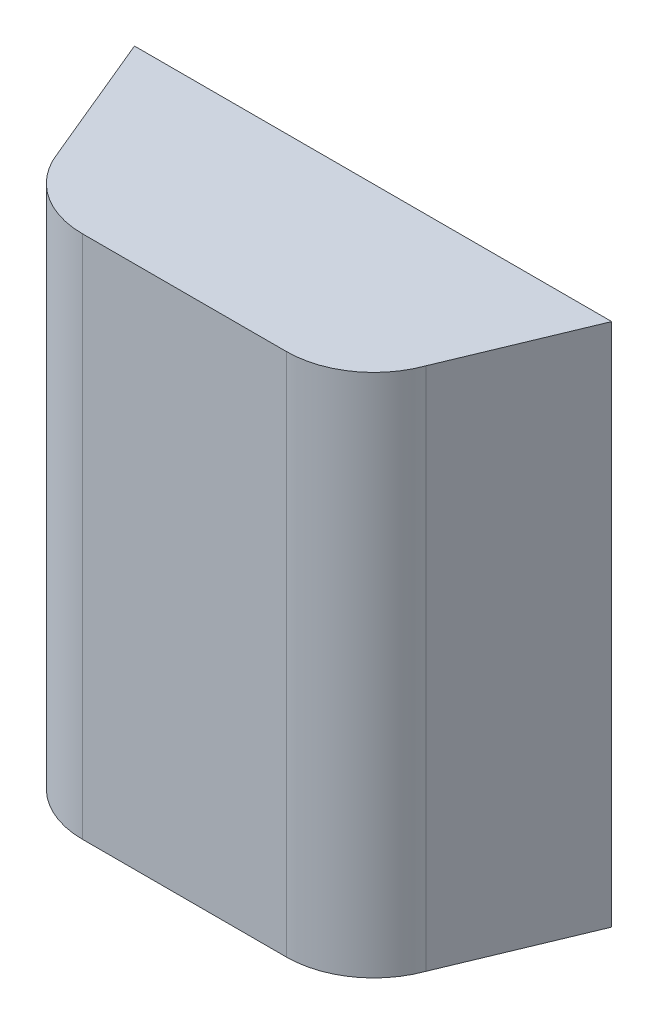
ISO-10303-21;
HEADER;
FILE_DESCRIPTION(('STEP AP214'),'2;1');
FILE_NAME('part.step','',(''),(''),'','','');
FILE_SCHEMA(('AUTOMOTIVE_DESIGN { 1 0 10303 214 1 1 1 1 }'));
ENDSEC;
DATA;
#1=APPLICATION_CONTEXT('core data for automotive mechanical design processes');
#2=APPLICATION_PROTOCOL_DEFINITION('international standard','automotive_design',2000,#1);
#3=PRODUCT_CONTEXT('',#1,'mechanical');
#4=PRODUCT('Part','Part','',(#3));
#5=PRODUCT_RELATED_PRODUCT_CATEGORY('part','',(#4));
#6=PRODUCT_DEFINITION_FORMATION('','',#4);
#7=PRODUCT_DEFINITION_CONTEXT('part definition',#1,'design');
#8=PRODUCT_DEFINITION('design','',#6,#7);
#9=PRODUCT_DEFINITION_SHAPE('','',#8);
#10=(LENGTH_UNIT() NAMED_UNIT(*) SI_UNIT(.MILLI.,.METRE.));
#11=(NAMED_UNIT(*) PLANE_ANGLE_UNIT() SI_UNIT($,.RADIAN.));
#12=(NAMED_UNIT(*) SI_UNIT($,.STERADIAN.) SOLID_ANGLE_UNIT());
#13=UNCERTAINTY_MEASURE_WITH_UNIT(LENGTH_MEASURE(1.E-05),#10,'distance_accuracy_value','');
#14=(GEOMETRIC_REPRESENTATION_CONTEXT(3) GLOBAL_UNCERTAINTY_ASSIGNED_CONTEXT((#13)) GLOBAL_UNIT_ASSIGNED_CONTEXT((#10,
#11,#12)) REPRESENTATION_CONTEXT('',''));
#15=CARTESIAN_POINT('',(0.,0.,0.));
#16=DIRECTION('',(0.,0.,1.));
#17=DIRECTION('',(1.,0.,0.));
#18=AXIS2_PLACEMENT_3D('',#15,#16,#17);
#19=CARTESIAN_POINT('',(-35.,180.,-30.));
#20=DIRECTION('',(0.,-1.,0.));
#21=DIRECTION('',(0.,0.,-1.));
#22=AXIS2_PLACEMENT_3D('',#19,#20,#21);
#23=CYLINDRICAL_SURFACE('',#22,30.);
#24=CARTESIAN_POINT('',(-35.,0.,-30.));
#25=DIRECTION('',(0.,1.,0.));
#26=DIRECTION('',(0.,0.,1.));
#27=AXIS2_PLACEMENT_3D('',#24,#25,#26);
#28=CIRCLE('',#27,30.);
#29=CARTESIAN_POINT('',(-63.1907786235773,0.,-19.73939570023));
#30=VERTEX_POINT('',#29);
#31=CARTESIAN_POINT('',(-35.,0.,0.));
#32=VERTEX_POINT('',#31);
#33=EDGE_CURVE('E131',#30,#32,#28,.T.);
#34=ORIENTED_EDGE('',*,*,#33,.T.);
#35=DIRECTION('',(0.,-1.,0.));
#36=VECTOR('',#35,1.);
#37=CARTESIAN_POINT('',(-35.,180.,0.));
#38=LINE('',#37,#36);
#39=CARTESIAN_POINT('',(-35.,180.,0.));
#40=VERTEX_POINT('',#39);
#41=EDGE_CURVE('E11',#40,#32,#38,.T.);
#42=ORIENTED_EDGE('',*,*,#41,.F.);
#43=CARTESIAN_POINT('',(-35.,180.,-30.));
#44=DIRECTION('',(0.,1.,0.));
#45=DIRECTION('',(0.,0.,1.));
#46=AXIS2_PLACEMENT_3D('',#43,#44,#45);
#47=CIRCLE('',#46,30.);
#48=CARTESIAN_POINT('',(-63.1907786235773,180.,-19.73939570023));
#49=VERTEX_POINT('',#48);
#50=EDGE_CURVE('E144',#49,#40,#47,.T.);
#51=ORIENTED_EDGE('',*,*,#50,.F.);
#52=DIRECTION('',(0.,-1.,0.));
#53=VECTOR('',#52,1.);
#54=CARTESIAN_POINT('',(-63.1907786235773,180.,-19.73939570023));
#55=LINE('',#54,#53);
#56=EDGE_CURVE('E127',#49,#30,#55,.T.);
#57=ORIENTED_EDGE('',*,*,#56,.T.);
#58=EDGE_LOOP('',(#34,#42,#51,#57));
#59=FACE_BOUND('',#58,.T.);
#60=ADVANCED_FACE('F33',(#59),#23,.T.);
#61=CARTESIAN_POINT('',(35.,180.,0.));
#62=DIRECTION('',(0.,0.,-1.));
#63=DIRECTION('',(-1.,0.,0.));
#64=AXIS2_PLACEMENT_3D('',#61,#62,#63);
#65=PLANE('',#64);
#66=DIRECTION('',(1.,0.,0.));
#67=VECTOR('',#66,1.);
#68=CARTESIAN_POINT('',(35.,0.,0.));
#69=LINE('',#68,#67);
#70=CARTESIAN_POINT('',(35.,0.,0.));
#71=VERTEX_POINT('',#70);
#72=EDGE_CURVE('E134',#32,#71,#69,.T.);
#73=ORIENTED_EDGE('',*,*,#72,.T.);
#74=DIRECTION('',(0.,-1.,0.));
#75=VECTOR('',#74,1.);
#76=CARTESIAN_POINT('',(35.,180.,0.));
#77=LINE('',#76,#75);
#78=CARTESIAN_POINT('',(35.,180.,0.));
#79=VERTEX_POINT('',#78);
#80=EDGE_CURVE('E40',#79,#71,#77,.T.);
#81=ORIENTED_EDGE('',*,*,#80,.F.);
#82=DIRECTION('',(1.,0.,0.));
#83=VECTOR('',#82,1.);
#84=CARTESIAN_POINT('',(35.,180.,0.));
#85=LINE('',#84,#83);
#86=EDGE_CURVE('E91',#40,#79,#85,.T.);
#87=ORIENTED_EDGE('',*,*,#86,.F.);
#88=ORIENTED_EDGE('',*,*,#41,.T.);
#89=EDGE_LOOP('',(#73,#81,#87,#88));
#90=FACE_BOUND('',#89,.T.);
#91=ADVANCED_FACE('F178',(#90),#65,.F.);
#92=CARTESIAN_POINT('',(35.,180.,-30.));
#93=DIRECTION('',(0.,-1.,0.));
#94=DIRECTION('',(0.,0.,-1.));
#95=AXIS2_PLACEMENT_3D('',#92,#93,#94);
#96=CYLINDRICAL_SURFACE('',#95,30.);
#97=CARTESIAN_POINT('',(35.,0.,-30.));
#98=DIRECTION('',(0.,1.,0.));
#99=DIRECTION('',(0.,0.,-1.));
#100=AXIS2_PLACEMENT_3D('',#97,#98,#99);
#101=CIRCLE('',#100,30.);
#102=CARTESIAN_POINT('',(63.1907786235773,0.,-19.73939570023));
#103=VERTEX_POINT('',#102);
#104=EDGE_CURVE('E137',#71,#103,#101,.T.);
#105=ORIENTED_EDGE('',*,*,#104,.T.);
#106=DIRECTION('',(0.,-1.,0.));
#107=VECTOR('',#106,1.);
#108=CARTESIAN_POINT('',(63.1907786235773,180.,-19.73939570023));
#109=LINE('',#108,#107);
#110=CARTESIAN_POINT('',(63.1907786235773,180.,-19.73939570023));
#111=VERTEX_POINT('',#110);
#112=EDGE_CURVE('E121',#111,#103,#109,.T.);
#113=ORIENTED_EDGE('',*,*,#112,.F.);
#114=CARTESIAN_POINT('',(35.,180.,-30.));
#115=DIRECTION('',(0.,1.,0.));
#116=DIRECTION('',(0.,0.,-1.));
#117=AXIS2_PLACEMENT_3D('',#114,#115,#116);
#118=CIRCLE('',#117,30.);
#119=EDGE_CURVE('E108',#79,#111,#118,.T.);
#120=ORIENTED_EDGE('',*,*,#119,.F.);
#121=ORIENTED_EDGE('',*,*,#80,.T.);
#122=EDGE_LOOP('',(#105,#113,#120,#121));
#123=FACE_BOUND('',#122,.T.);
#124=ADVANCED_FACE('F150',(#123),#96,.T.);
#125=CARTESIAN_POINT('',(81.9087136929461,180.,-64.73939570023));
#126=DIRECTION('',(-0.923310329831068,0.,-0.384054728947898));
#127=DIRECTION('',(-0.384054728947898,0.,0.923310329831069));
#128=AXIS2_PLACEMENT_3D('',#125,#126,#127);
#129=PLANE('',#128);
#130=DIRECTION('',(0.384054728947898,0.,-0.923310329831069));
#131=VECTOR('',#130,1.);
#132=CARTESIAN_POINT('',(81.9087136929461,0.,-64.73939570023));
#133=LINE('',#132,#131);
#134=CARTESIAN_POINT('',(81.9087136929461,0.,-64.73939570023));
#135=VERTEX_POINT('',#134);
#136=EDGE_CURVE('E117',#103,#135,#133,.T.);
#137=ORIENTED_EDGE('',*,*,#136,.T.);
#138=DIRECTION('',(0.,-1.,0.));
#139=VECTOR('',#138,1.);
#140=CARTESIAN_POINT('',(81.9087136929461,180.,-64.73939570023));
#141=LINE('',#140,#139);
#142=CARTESIAN_POINT('',(81.9087136929461,180.,-64.73939570023));
#143=VERTEX_POINT('',#142);
#144=EDGE_CURVE('E114',#143,#135,#141,.T.);
#145=ORIENTED_EDGE('',*,*,#144,.F.);
#146=DIRECTION('',(0.384054728947898,0.,-0.923310329831069));
#147=VECTOR('',#146,1.);
#148=CARTESIAN_POINT('',(81.9087136929461,180.,-64.73939570023));
#149=LINE('',#148,#147);
#150=EDGE_CURVE('E101',#111,#143,#149,.T.);
#151=ORIENTED_EDGE('',*,*,#150,.F.);
#152=ORIENTED_EDGE('',*,*,#112,.T.);
#153=EDGE_LOOP('',(#137,#145,#151,#152));
#154=FACE_BOUND('',#153,.T.);
#155=ADVANCED_FACE('F115',(#154),#129,.F.);
#156=CARTESIAN_POINT('',(-81.9087136929461,180.,-64.73939570023));
#157=DIRECTION('',(0.,0.,1.));
#158=DIRECTION('',(1.,0.,0.));
#159=AXIS2_PLACEMENT_3D('',#156,#157,#158);
#160=PLANE('',#159);
#161=DIRECTION('',(1.,0.,0.));
#162=VECTOR('',#161,1.);
#163=CARTESIAN_POINT('',(-78.9087136929462,176.,-64.73939570023));
#164=LINE('',#163,#162);
#165=CARTESIAN_POINT('',(-78.9087136929462,176.,-64.73939570023));
#166=VERTEX_POINT('',#165);
#167=CARTESIAN_POINT('',(78.9087136929462,176.,-64.73939570023));
#168=VERTEX_POINT('',#167);
#169=EDGE_CURVE('E161',#166,#168,#164,.T.);
#170=ORIENTED_EDGE('',*,*,#169,.F.);
#171=DIRECTION('',(0.,-1.,0.));
#172=VECTOR('',#171,1.);
#173=CARTESIAN_POINT('',(-78.9087136929462,176.,-64.73939570023));
#174=LINE('',#173,#172);
#175=CARTESIAN_POINT('',(-78.9087136929462,0.,-64.73939570023));
#176=VERTEX_POINT('',#175);
#177=EDGE_CURVE('E165',#166,#176,#174,.T.);
#178=ORIENTED_EDGE('',*,*,#177,.T.);
#179=DIRECTION('',(-1.,0.,0.));
#180=VECTOR('',#179,1.);
#181=CARTESIAN_POINT('',(-81.9087136929461,0.,-64.73939570023));
#182=LINE('',#181,#180);
#183=CARTESIAN_POINT('',(-81.9087136929461,0.,-64.73939570023));
#184=VERTEX_POINT('',#183);
#185=EDGE_CURVE('E140',#176,#184,#182,.T.);
#186=ORIENTED_EDGE('',*,*,#185,.T.);
#187=DIRECTION('',(0.,-1.,0.));
#188=VECTOR('',#187,1.);
#189=CARTESIAN_POINT('',(-81.9087136929461,180.,-64.73939570023));
#190=LINE('',#189,#188);
#191=CARTESIAN_POINT('',(-81.9087136929461,180.,-64.73939570023));
#192=VERTEX_POINT('',#191);
#193=EDGE_CURVE('E122',#192,#184,#190,.T.);
#194=ORIENTED_EDGE('',*,*,#193,.F.);
#195=DIRECTION('',(-1.,0.,0.));
#196=VECTOR('',#195,1.);
#197=CARTESIAN_POINT('',(-81.9087136929461,180.,-64.73939570023));
#198=LINE('',#197,#196);
#199=EDGE_CURVE('E105',#143,#192,#198,.T.);
#200=ORIENTED_EDGE('',*,*,#199,.F.);
#201=ORIENTED_EDGE('',*,*,#144,.T.);
#202=CARTESIAN_POINT('',(78.9087136929462,0.,-64.73939570023));
#203=VERTEX_POINT('',#202);
#204=EDGE_CURVE('E141',#135,#203,#182,.T.);
#205=ORIENTED_EDGE('',*,*,#204,.T.);
#206=DIRECTION('',(0.,-1.,0.));
#207=VECTOR('',#206,1.);
#208=CARTESIAN_POINT('',(78.9087136929462,176.,-64.73939570023));
#209=LINE('',#208,#207);
#210=EDGE_CURVE('E47',#168,#203,#209,.T.);
#211=ORIENTED_EDGE('',*,*,#210,.F.);
#212=EDGE_LOOP('',(#170,#178,#186,#194,#200,#201,#205,#211));
#213=FACE_BOUND('',#212,.T.);
#214=ADVANCED_FACE('F125',(#213),#160,.F.);
#215=CARTESIAN_POINT('',(-81.9087136929461,180.,-64.73939570023));
#216=DIRECTION('',(0.923310329831068,0.,-0.384054728947898));
#217=DIRECTION('',(-0.384054728947898,0.,-0.923310329831069));
#218=AXIS2_PLACEMENT_3D('',#215,#216,#217);
#219=PLANE('',#218);
#220=DIRECTION('',(0.384054728947898,0.,0.923310329831069));
#221=VECTOR('',#220,1.);
#222=CARTESIAN_POINT('',(-81.9087136929461,0.,-64.73939570023));
#223=LINE('',#222,#221);
#224=EDGE_CURVE('E83',#184,#30,#223,.T.);
#225=ORIENTED_EDGE('',*,*,#224,.T.);
#226=ORIENTED_EDGE('',*,*,#56,.F.);
#227=DIRECTION('',(0.384054728947898,0.,0.923310329831069));
#228=VECTOR('',#227,1.);
#229=CARTESIAN_POINT('',(-81.9087136929461,180.,-64.73939570023));
#230=LINE('',#229,#228);
#231=EDGE_CURVE('E56',#192,#49,#230,.T.);
#232=ORIENTED_EDGE('',*,*,#231,.F.);
#233=ORIENTED_EDGE('',*,*,#193,.T.);
#234=EDGE_LOOP('',(#225,#226,#232,#233));
#235=FACE_BOUND('',#234,.T.);
#236=ADVANCED_FACE('F190',(#235),#219,.F.);
#237=CARTESIAN_POINT('',(-35.,180.,-30.));
#238=DIRECTION('',(0.,1.,0.));
#239=DIRECTION('',(0.,0.,1.));
#240=AXIS2_PLACEMENT_3D('',#237,#238,#239);
#241=PLANE('',#240);
#242=ORIENTED_EDGE('',*,*,#50,.T.);
#243=ORIENTED_EDGE('',*,*,#86,.T.);
#244=ORIENTED_EDGE('',*,*,#119,.T.);
#245=ORIENTED_EDGE('',*,*,#150,.T.);
#246=ORIENTED_EDGE('',*,*,#199,.T.);
#247=ORIENTED_EDGE('',*,*,#231,.T.);
#248=EDGE_LOOP('',(#242,#243,#244,#245,#246,#247));
#249=FACE_BOUND('',#248,.T.);
#250=ADVANCED_FACE('F103',(#249),#241,.T.);
#251=CARTESIAN_POINT('',(-35.,0.,-30.));
#252=DIRECTION('',(0.,1.,0.));
#253=DIRECTION('',(0.,0.,1.));
#254=AXIS2_PLACEMENT_3D('',#251,#252,#253);
#255=PLANE('',#254);
#256=ORIENTED_EDGE('',*,*,#185,.F.);
#257=DIRECTION('',(-0.388514258829521,0.,-0.921442711559513));
#258=VECTOR('',#257,1.);
#259=CARTESIAN_POINT('',(-60.7888694367235,0.,-21.7644004586366));
#260=LINE('',#259,#258);
#261=CARTESIAN_POINT('',(-60.7888694367235,0.,-21.7644004586366));
#262=VERTEX_POINT('',#261);
#263=EDGE_CURVE('E233',#262,#176,#260,.T.);
#264=ORIENTED_EDGE('',*,*,#263,.F.);
#265=CARTESIAN_POINT('',(-35.,0.,-3.));
#266=CARTESIAN_POINT('',(-54.7695230961747,0.,-6.84226263463313));
#267=CARTESIAN_POINT('',(-60.7888694367235,0.,-21.7644004586366));
#268=B_SPLINE_CURVE_WITH_KNOTS('',2,(#265,#266,#267),.UNSPECIFIED.,.F.,.F.,(3,3),(0.,1.),.UNSPECIFIED.);
#269=CARTESIAN_POINT('',(-35.,0.,-3.));
#270=VERTEX_POINT('',#269);
#271=EDGE_CURVE('E253',#270,#262,#268,.T.);
#272=ORIENTED_EDGE('',*,*,#271,.F.);
#273=DIRECTION('',(-1.,0.,0.));
#274=VECTOR('',#273,1.);
#275=CARTESIAN_POINT('',(-35.,0.,-3.));
#276=LINE('',#275,#274);
#277=CARTESIAN_POINT('',(35.,0.,-3.));
#278=VERTEX_POINT('',#277);
#279=EDGE_CURVE('E256',#278,#270,#276,.T.);
#280=ORIENTED_EDGE('',*,*,#279,.F.);
#281=CARTESIAN_POINT('',(60.7888694367235,0.,-21.7644004586366));
#282=CARTESIAN_POINT('',(54.7695230961747,0.,-6.84226263463313));
#283=CARTESIAN_POINT('',(35.,0.,-3.));
#284=B_SPLINE_CURVE_WITH_KNOTS('',2,(#281,#282,#283),.UNSPECIFIED.,.F.,.F.,(3,3),(0.,1.),.UNSPECIFIED.);
#285=CARTESIAN_POINT('',(60.7888694367235,0.,-21.7644004586366));
#286=VERTEX_POINT('',#285);
#287=EDGE_CURVE('E263',#286,#278,#284,.T.);
#288=ORIENTED_EDGE('',*,*,#287,.F.);
#289=DIRECTION('',(-0.388514258829521,0.,0.921442711559513));
#290=VECTOR('',#289,1.);
#291=CARTESIAN_POINT('',(60.7888694367235,0.,-21.7644004586366));
#292=LINE('',#291,#290);
#293=EDGE_CURVE('E156',#203,#286,#292,.T.);
#294=ORIENTED_EDGE('',*,*,#293,.F.);
#295=ORIENTED_EDGE('',*,*,#204,.F.);
#296=ORIENTED_EDGE('',*,*,#136,.F.);
#297=ORIENTED_EDGE('',*,*,#104,.F.);
#298=ORIENTED_EDGE('',*,*,#72,.F.);
#299=ORIENTED_EDGE('',*,*,#33,.F.);
#300=ORIENTED_EDGE('',*,*,#224,.F.);
#301=EDGE_LOOP('',(#256,#264,#272,#280,#288,#294,#295,#296,#297,#298,#299,#300));
#302=FACE_BOUND('',#301,.T.);
#303=ADVANCED_FACE('F153',(#302),#255,.F.);
#304=CARTESIAN_POINT('',(-60.7888694367235,176.,-21.7644004586366));
#305=DIRECTION('',(-0.921442711559513,0.,0.388514258829521));
#306=DIRECTION('',(0.388514258829521,0.,0.921442711559513));
#307=AXIS2_PLACEMENT_3D('',#304,#305,#306);
#308=PLANE('',#307);
#309=ORIENTED_EDGE('',*,*,#263,.T.);
#310=ORIENTED_EDGE('',*,*,#177,.F.);
#311=DIRECTION('',(-0.388514258829521,0.,-0.921442711559513));
#312=VECTOR('',#311,1.);
#313=CARTESIAN_POINT('',(-60.7888694367235,176.,-21.7644004586366));
#314=LINE('',#313,#312);
#315=CARTESIAN_POINT('',(-60.7888694367235,176.,-21.7644004586366));
#316=VERTEX_POINT('',#315);
#317=EDGE_CURVE('E247',#316,#166,#314,.T.);
#318=ORIENTED_EDGE('',*,*,#317,.F.);
#319=DIRECTION('',(0.,-1.,0.));
#320=VECTOR('',#319,1.);
#321=CARTESIAN_POINT('',(-60.7888694367235,176.,-21.7644004586366));
#322=LINE('',#321,#320);
#323=EDGE_CURVE('E135',#316,#262,#322,.T.);
#324=ORIENTED_EDGE('',*,*,#323,.T.);
#325=EDGE_LOOP('',(#309,#310,#318,#324));
#326=FACE_BOUND('',#325,.T.);
#327=ADVANCED_FACE('F195',(#326),#308,.F.);
#328=CARTESIAN_POINT('',(-35.,176.,-3.));
#329=CARTESIAN_POINT('',(-54.7695230961747,176.,-6.84226263463313));
#330=CARTESIAN_POINT('',(-60.7888694367235,176.,-21.7644004586366));
#331=B_SPLINE_CURVE_WITH_KNOTS('',2,(#328,#329,#330),.UNSPECIFIED.,.F.,.F.,(3,3),(0.,1.),.UNSPECIFIED.);
#332=DIRECTION('',(0.,-1.,0.));
#333=VECTOR('',#332,1.);
#334=SURFACE_OF_LINEAR_EXTRUSION('',#331,#333);
#335=ORIENTED_EDGE('',*,*,#271,.T.);
#336=ORIENTED_EDGE('',*,*,#323,.F.);
#337=CARTESIAN_POINT('',(-35.,176.,-3.));
#338=VERTEX_POINT('',#337);
#339=EDGE_CURVE('E170',#338,#316,#331,.T.);
#340=ORIENTED_EDGE('',*,*,#339,.F.);
#341=DIRECTION('',(0.,-1.,0.));
#342=VECTOR('',#341,1.);
#343=CARTESIAN_POINT('',(-35.,176.,-3.));
#344=LINE('',#343,#342);
#345=EDGE_CURVE('E273',#338,#270,#344,.T.);
#346=ORIENTED_EDGE('',*,*,#345,.T.);
#347=EDGE_LOOP('',(#335,#336,#340,#346));
#348=FACE_BOUND('',#347,.T.);
#349=ADVANCED_FACE('F200',(#348),#334,.F.);
#350=CARTESIAN_POINT('',(-35.,176.,-3.));
#351=DIRECTION('',(0.,0.,1.));
#352=DIRECTION('',(1.,0.,0.));
#353=AXIS2_PLACEMENT_3D('',#350,#351,#352);
#354=PLANE('',#353);
#355=ORIENTED_EDGE('',*,*,#279,.T.);
#356=ORIENTED_EDGE('',*,*,#345,.F.);
#357=DIRECTION('',(-1.,0.,0.));
#358=VECTOR('',#357,1.);
#359=CARTESIAN_POINT('',(-35.,176.,-3.));
#360=LINE('',#359,#358);
#361=CARTESIAN_POINT('',(35.,176.,-3.));
#362=VERTEX_POINT('',#361);
#363=EDGE_CURVE('E220',#362,#338,#360,.T.);
#364=ORIENTED_EDGE('',*,*,#363,.F.);
#365=DIRECTION('',(0.,-1.,0.));
#366=VECTOR('',#365,1.);
#367=CARTESIAN_POINT('',(35.,176.,-3.));
#368=LINE('',#367,#366);
#369=EDGE_CURVE('E168',#362,#278,#368,.T.);
#370=ORIENTED_EDGE('',*,*,#369,.T.);
#371=EDGE_LOOP('',(#355,#356,#364,#370));
#372=FACE_BOUND('',#371,.T.);
#373=ADVANCED_FACE('F210',(#372),#354,.F.);
#374=CARTESIAN_POINT('',(60.7888694367235,176.,-21.7644004586366));
#375=CARTESIAN_POINT('',(54.7695230961747,176.,-6.84226263463313));
#376=CARTESIAN_POINT('',(35.,176.,-3.));
#377=B_SPLINE_CURVE_WITH_KNOTS('',2,(#374,#375,#376),.UNSPECIFIED.,.F.,.F.,(3,3),(0.,1.),.UNSPECIFIED.);
#378=DIRECTION('',(0.,-1.,0.));
#379=VECTOR('',#378,1.);
#380=SURFACE_OF_LINEAR_EXTRUSION('',#377,#379);
#381=ORIENTED_EDGE('',*,*,#287,.T.);
#382=ORIENTED_EDGE('',*,*,#369,.F.);
#383=CARTESIAN_POINT('',(60.7888694367235,176.,-21.7644004586366));
#384=VERTEX_POINT('',#383);
#385=EDGE_CURVE('E213',#384,#362,#377,.T.);
#386=ORIENTED_EDGE('',*,*,#385,.F.);
#387=DIRECTION('',(0.,-1.,0.));
#388=VECTOR('',#387,1.);
#389=CARTESIAN_POINT('',(60.7888694367235,176.,-21.7644004586366));
#390=LINE('',#389,#388);
#391=EDGE_CURVE('E164',#384,#286,#390,.T.);
#392=ORIENTED_EDGE('',*,*,#391,.T.);
#393=EDGE_LOOP('',(#381,#382,#386,#392));
#394=FACE_BOUND('',#393,.T.);
#395=ADVANCED_FACE('F206',(#394),#380,.F.);
#396=CARTESIAN_POINT('',(60.7888694367235,176.,-21.7644004586366));
#397=DIRECTION('',(0.921442711559513,0.,0.388514258829521));
#398=DIRECTION('',(0.388514258829521,0.,-0.921442711559513));
#399=AXIS2_PLACEMENT_3D('',#396,#397,#398);
#400=PLANE('',#399);
#401=ORIENTED_EDGE('',*,*,#293,.T.);
#402=ORIENTED_EDGE('',*,*,#391,.F.);
#403=DIRECTION('',(-0.388514258829521,0.,0.921442711559513));
#404=VECTOR('',#403,1.);
#405=CARTESIAN_POINT('',(60.7888694367235,176.,-21.7644004586366));
#406=LINE('',#405,#404);
#407=EDGE_CURVE('E221',#168,#384,#406,.T.);
#408=ORIENTED_EDGE('',*,*,#407,.F.);
#409=ORIENTED_EDGE('',*,*,#210,.T.);
#410=EDGE_LOOP('',(#401,#402,#408,#409));
#411=FACE_BOUND('',#410,.T.);
#412=ADVANCED_FACE('F202',(#411),#400,.F.);
#413=CARTESIAN_POINT('',(51.3319789072682,176.,-9.61223143197572));
#414=DIRECTION('',(0.,-1.,0.));
#415=DIRECTION('',(0.,0.,-1.));
#416=AXIS2_PLACEMENT_3D('',#413,#414,#415);
#417=PLANE('',#416);
#418=ORIENTED_EDGE('',*,*,#317,.T.);
#419=ORIENTED_EDGE('',*,*,#169,.T.);
#420=ORIENTED_EDGE('',*,*,#407,.T.);
#421=ORIENTED_EDGE('',*,*,#385,.T.);
#422=ORIENTED_EDGE('',*,*,#363,.T.);
#423=ORIENTED_EDGE('',*,*,#339,.T.);
#424=EDGE_LOOP('',(#418,#419,#420,#421,#422,#423));
#425=FACE_BOUND('',#424,.T.);
#426=ADVANCED_FACE('F205',(#425),#417,.T.);
#427=CLOSED_SHELL('',(#60,#91,#124,#155,#214,#236,#250,#303,#327,#349,#373,#395,#412,#426));
#428=MANIFOLD_SOLID_BREP('B2',#427);
#429=ADVANCED_BREP_SHAPE_REPRESENTATION('',(#18,#428),#14);
#430=SHAPE_DEFINITION_REPRESENTATION(#9,#429);
ENDSEC;
END-ISO-10303-21;
